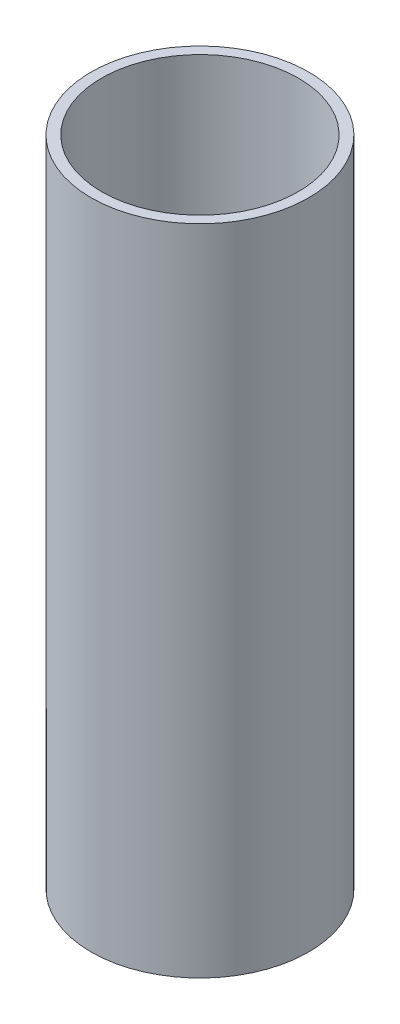
ISO-10303-21;
HEADER;
FILE_DESCRIPTION(('STEP AP214'),'2;1');
FILE_NAME('part.step','',(''),(''),'','','');
FILE_SCHEMA(('AUTOMOTIVE_DESIGN { 1 0 10303 214 1 1 1 1 }'));
ENDSEC;
DATA;
#1=APPLICATION_CONTEXT('core data for automotive mechanical design processes');
#2=APPLICATION_PROTOCOL_DEFINITION('international standard','automotive_design',2000,#1);
#3=PRODUCT_CONTEXT('',#1,'mechanical');
#4=PRODUCT('Part','Part','',(#3));
#5=PRODUCT_RELATED_PRODUCT_CATEGORY('part','',(#4));
#6=PRODUCT_DEFINITION_FORMATION('','',#4);
#7=PRODUCT_DEFINITION_CONTEXT('part definition',#1,'design');
#8=PRODUCT_DEFINITION('design','',#6,#7);
#9=PRODUCT_DEFINITION_SHAPE('','',#8);
#10=(LENGTH_UNIT() NAMED_UNIT(*) SI_UNIT(.MILLI.,.METRE.));
#11=(NAMED_UNIT(*) PLANE_ANGLE_UNIT() SI_UNIT($,.RADIAN.));
#12=(NAMED_UNIT(*) SI_UNIT($,.STERADIAN.) SOLID_ANGLE_UNIT());
#13=UNCERTAINTY_MEASURE_WITH_UNIT(LENGTH_MEASURE(1.E-05),#10,'distance_accuracy_value','');
#14=(GEOMETRIC_REPRESENTATION_CONTEXT(3) GLOBAL_UNCERTAINTY_ASSIGNED_CONTEXT((#13)) GLOBAL_UNIT_ASSIGNED_CONTEXT((#10,
#11,#12)) REPRESENTATION_CONTEXT('',''));
#15=CARTESIAN_POINT('',(0.,0.,0.));
#16=DIRECTION('',(0.,0.,1.));
#17=DIRECTION('',(1.,0.,0.));
#18=AXIS2_PLACEMENT_3D('',#15,#16,#17);
#19=CARTESIAN_POINT('',(0.,150.,0.));
#20=DIRECTION('',(0.,1.,0.));
#21=DIRECTION('',(0.,0.,1.));
#22=AXIS2_PLACEMENT_3D('',#19,#20,#21);
#23=PLANE('',#22);
#24=CARTESIAN_POINT('',(0.,150.,0.));
#25=DIRECTION('',(0.,1.,0.));
#26=DIRECTION('',(0.,0.,1.));
#27=AXIS2_PLACEMENT_3D('',#24,#25,#26);
#28=CIRCLE('',#27,25.);
#29=CARTESIAN_POINT('',(0.,150.,25.));
#30=VERTEX_POINT('',#29);
#31=EDGE_CURVE('E10',#30,#30,#28,.T.);
#32=ORIENTED_EDGE('',*,*,#31,.T.);
#33=EDGE_LOOP('',(#32));
#34=FACE_BOUND('',#33,.T.);
#35=CARTESIAN_POINT('',(0.,150.,0.));
#36=DIRECTION('',(0.,1.,0.));
#37=DIRECTION('',(0.,0.,1.));
#38=AXIS2_PLACEMENT_3D('',#35,#36,#37);
#39=CIRCLE('',#38,22.6);
#40=CARTESIAN_POINT('',(0.,150.,22.6));
#41=VERTEX_POINT('',#40);
#42=EDGE_CURVE('E50',#41,#41,#39,.T.);
#43=ORIENTED_EDGE('',*,*,#42,.F.);
#44=EDGE_LOOP('',(#43));
#45=FACE_BOUND('',#44,.T.);
#46=ADVANCED_FACE('F37',(#34,#45),#23,.T.);
#47=CARTESIAN_POINT('',(0.,0.,0.));
#48=DIRECTION('',(0.,1.,0.));
#49=DIRECTION('',(0.,0.,1.));
#50=AXIS2_PLACEMENT_3D('',#47,#48,#49);
#51=PLANE('',#50);
#52=CARTESIAN_POINT('',(0.,0.,0.));
#53=DIRECTION('',(0.,1.,0.));
#54=DIRECTION('',(0.,0.,1.));
#55=AXIS2_PLACEMENT_3D('',#52,#53,#54);
#56=CIRCLE('',#55,25.);
#57=CARTESIAN_POINT('',(0.,0.,25.));
#58=VERTEX_POINT('',#57);
#59=EDGE_CURVE('E41',#58,#58,#56,.T.);
#60=ORIENTED_EDGE('',*,*,#59,.F.);
#61=EDGE_LOOP('',(#60));
#62=FACE_BOUND('',#61,.T.);
#63=CARTESIAN_POINT('',(0.,0.,0.));
#64=DIRECTION('',(0.,1.,0.));
#65=DIRECTION('',(0.,0.,1.));
#66=AXIS2_PLACEMENT_3D('',#63,#64,#65);
#67=CIRCLE('',#66,22.6);
#68=CARTESIAN_POINT('',(0.,0.,22.6));
#69=VERTEX_POINT('',#68);
#70=EDGE_CURVE('E52',#69,#69,#67,.T.);
#71=ORIENTED_EDGE('',*,*,#70,.T.);
#72=EDGE_LOOP('',(#71));
#73=FACE_BOUND('',#72,.T.);
#74=ADVANCED_FACE('F64',(#62,#73),#51,.F.);
#75=CARTESIAN_POINT('',(0.,150.,0.));
#76=DIRECTION('',(0.,-1.,0.));
#77=DIRECTION('',(0.,0.,-1.));
#78=AXIS2_PLACEMENT_3D('',#75,#76,#77);
#79=CYLINDRICAL_SURFACE('',#78,25.);
#80=ORIENTED_EDGE('',*,*,#31,.F.);
#81=EDGE_LOOP('',(#80));
#82=FACE_BOUND('',#81,.T.);
#83=ORIENTED_EDGE('',*,*,#59,.T.);
#84=EDGE_LOOP('',(#83));
#85=FACE_BOUND('',#84,.T.);
#86=ADVANCED_FACE('F39',(#82,#85),#79,.T.);
#87=CARTESIAN_POINT('',(0.,150.,0.));
#88=DIRECTION('',(0.,-1.,0.));
#89=DIRECTION('',(0.,0.,-1.));
#90=AXIS2_PLACEMENT_3D('',#87,#88,#89);
#91=CYLINDRICAL_SURFACE('',#90,22.6);
#92=ORIENTED_EDGE('',*,*,#42,.T.);
#93=EDGE_LOOP('',(#92));
#94=FACE_BOUND('',#93,.T.);
#95=ORIENTED_EDGE('',*,*,#70,.F.);
#96=EDGE_LOOP('',(#95));
#97=FACE_BOUND('',#96,.T.);
#98=ADVANCED_FACE('F60',(#94,#97),#91,.F.);
#99=CLOSED_SHELL('',(#46,#74,#86,#98));
#100=MANIFOLD_SOLID_BREP('B2',#99);
#101=ADVANCED_BREP_SHAPE_REPRESENTATION('',(#18,#100),#14);
#102=SHAPE_DEFINITION_REPRESENTATION(#9,#101);
ENDSEC;
END-ISO-10303-21;
